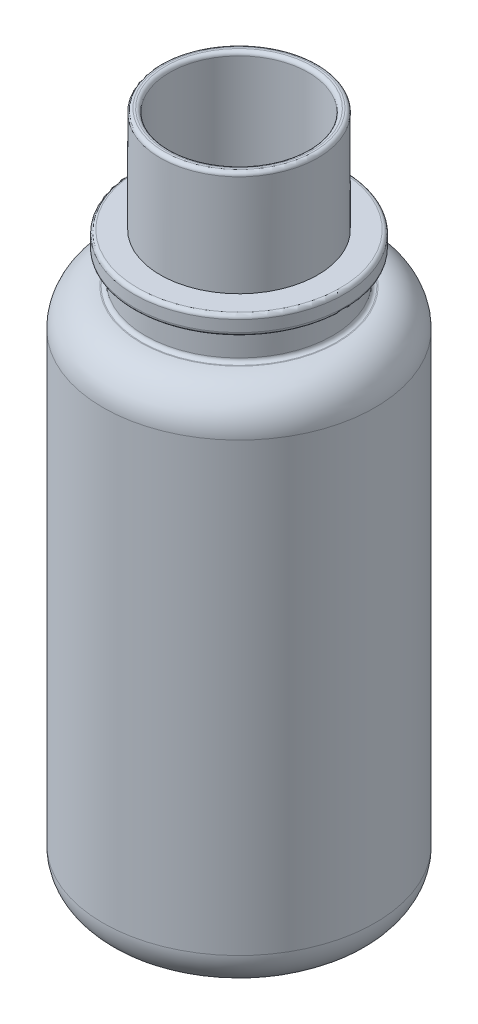
ISO-10303-21;
HEADER;
FILE_DESCRIPTION(('STEP AP214'),'2;1');
FILE_NAME('part.step','',(''),(''),'','','');
FILE_SCHEMA(('AUTOMOTIVE_DESIGN { 1 0 10303 214 1 1 1 1 }'));
ENDSEC;
DATA;
#1=APPLICATION_CONTEXT('core data for automotive mechanical design processes');
#2=APPLICATION_PROTOCOL_DEFINITION('international standard','automotive_design',2000,#1);
#3=PRODUCT_CONTEXT('',#1,'mechanical');
#4=PRODUCT('Part','Part','',(#3));
#5=PRODUCT_RELATED_PRODUCT_CATEGORY('part','',(#4));
#6=PRODUCT_DEFINITION_FORMATION('','',#4);
#7=PRODUCT_DEFINITION_CONTEXT('part definition',#1,'design');
#8=PRODUCT_DEFINITION('design','',#6,#7);
#9=PRODUCT_DEFINITION_SHAPE('','',#8);
#10=(LENGTH_UNIT() NAMED_UNIT(*) SI_UNIT(.MILLI.,.METRE.));
#11=(NAMED_UNIT(*) PLANE_ANGLE_UNIT() SI_UNIT($,.RADIAN.));
#12=(NAMED_UNIT(*) SI_UNIT($,.STERADIAN.) SOLID_ANGLE_UNIT());
#13=UNCERTAINTY_MEASURE_WITH_UNIT(LENGTH_MEASURE(1.E-05),#10,'distance_accuracy_value','');
#14=(GEOMETRIC_REPRESENTATION_CONTEXT(3) GLOBAL_UNCERTAINTY_ASSIGNED_CONTEXT((#13)) GLOBAL_UNIT_ASSIGNED_CONTEXT((#10,
#11,#12)) REPRESENTATION_CONTEXT('',''));
#15=CARTESIAN_POINT('',(0.,0.,0.));
#16=DIRECTION('',(0.,0.,1.));
#17=DIRECTION('',(1.,0.,0.));
#18=AXIS2_PLACEMENT_3D('',#15,#16,#17);
#19=CARTESIAN_POINT('',(0.,0.,0.));
#20=DIRECTION('',(0.,-1.,0.));
#21=DIRECTION('',(0.,0.,-1.));
#22=AXIS2_PLACEMENT_3D('',#19,#20,#21);
#23=PLANE('',#22);
#24=CARTESIAN_POINT('',(0.,0.,0.));
#25=DIRECTION('',(0.,-1.,0.));
#26=DIRECTION('',(0.,0.,-1.));
#27=AXIS2_PLACEMENT_3D('',#24,#25,#26);
#28=CIRCLE('',#27,13.335);
#29=CARTESIAN_POINT('',(0.,0.,-13.335));
#30=VERTEX_POINT('',#29);
#31=EDGE_CURVE('E100',#30,#30,#28,.T.);
#32=ORIENTED_EDGE('',*,*,#31,.T.);
#33=EDGE_LOOP('',(#32));
#34=FACE_BOUND('',#33,.T.);
#35=ADVANCED_FACE('F35',(#34),#23,.T.);
#36=CARTESIAN_POINT('',(0.,0.,0.));
#37=DIRECTION('',(0.,-1.,0.));
#38=DIRECTION('',(0.,0.,-1.));
#39=AXIS2_PLACEMENT_3D('',#36,#37,#38);
#40=CYLINDRICAL_SURFACE('',#39,18.415);
#41=CARTESIAN_POINT('',(0.,5.08,0.));
#42=DIRECTION('',(0.,-1.,0.));
#43=DIRECTION('',(0.,0.,-1.));
#44=AXIS2_PLACEMENT_3D('',#41,#42,#43);
#45=CIRCLE('',#44,18.415);
#46=CARTESIAN_POINT('',(0.,5.08,-18.415));
#47=VERTEX_POINT('',#46);
#48=EDGE_CURVE('E94',#47,#47,#45,.F.);
#49=ORIENTED_EDGE('',*,*,#48,.T.);
#50=EDGE_LOOP('',(#49));
#51=FACE_BOUND('',#50,.T.);
#52=CARTESIAN_POINT('',(0.,65.532,0.));
#53=DIRECTION('',(0.,1.,0.));
#54=DIRECTION('',(0.,0.,1.));
#55=AXIS2_PLACEMENT_3D('',#52,#53,#54);
#56=CIRCLE('',#55,18.415);
#57=CARTESIAN_POINT('',(0.,65.532,18.415));
#58=VERTEX_POINT('',#57);
#59=EDGE_CURVE('E97',#58,#58,#56,.F.);
#60=ORIENTED_EDGE('',*,*,#59,.T.);
#61=EDGE_LOOP('',(#60));
#62=FACE_BOUND('',#61,.T.);
#63=ADVANCED_FACE('F139',(#51,#62),#40,.T.);
#64=CARTESIAN_POINT('',(18.415,70.612,0.));
#65=DIRECTION('',(0.,1.,0.));
#66=DIRECTION('',(0.,0.,1.));
#67=AXIS2_PLACEMENT_3D('',#64,#65,#66);
#68=PLANE('',#67);
#69=CARTESIAN_POINT('',(0.,70.612,0.));
#70=DIRECTION('',(0.,1.,0.));
#71=DIRECTION('',(0.,0.,1.));
#72=AXIS2_PLACEMENT_3D('',#69,#70,#71);
#73=CIRCLE('',#72,13.208);
#74=CARTESIAN_POINT('',(0.,70.612,13.208));
#75=VERTEX_POINT('',#74);
#76=EDGE_CURVE('E58',#75,#75,#73,.F.);
#77=ORIENTED_EDGE('',*,*,#76,.T.);
#78=EDGE_LOOP('',(#77));
#79=FACE_BOUND('',#78,.T.);
#80=CARTESIAN_POINT('',(0.,70.612,0.));
#81=DIRECTION('',(0.,1.,0.));
#82=DIRECTION('',(0.,0.,1.));
#83=AXIS2_PLACEMENT_3D('',#80,#81,#82);
#84=CIRCLE('',#83,13.335);
#85=CARTESIAN_POINT('',(0.,70.612,13.335));
#86=VERTEX_POINT('',#85);
#87=EDGE_CURVE('E91',#86,#86,#84,.T.);
#88=ORIENTED_EDGE('',*,*,#87,.T.);
#89=EDGE_LOOP('',(#88));
#90=FACE_BOUND('',#89,.T.);
#91=ADVANCED_FACE('F145',(#79,#90),#68,.T.);
#92=CARTESIAN_POINT('',(0.,0.,0.));
#93=DIRECTION('',(0.,-1.,0.));
#94=DIRECTION('',(0.,0.,-1.));
#95=AXIS2_PLACEMENT_3D('',#92,#93,#94);
#96=CYLINDRICAL_SURFACE('',#95,12.7);
#97=CARTESIAN_POINT('',(0.,71.12,0.));
#98=DIRECTION('',(0.,1.,0.));
#99=DIRECTION('',(0.,0.,1.));
#100=AXIS2_PLACEMENT_3D('',#97,#98,#99);
#101=CIRCLE('',#100,12.7);
#102=CARTESIAN_POINT('',(0.,71.12,12.7));
#103=VERTEX_POINT('',#102);
#104=EDGE_CURVE('E55',#103,#103,#101,.T.);
#105=ORIENTED_EDGE('',*,*,#104,.T.);
#106=EDGE_LOOP('',(#105));
#107=FACE_BOUND('',#106,.T.);
#108=CARTESIAN_POINT('',(0.,74.676,0.));
#109=DIRECTION('',(0.,-1.,0.));
#110=DIRECTION('',(0.,0.,-1.));
#111=AXIS2_PLACEMENT_3D('',#108,#109,#110);
#112=CIRCLE('',#111,12.7);
#113=CARTESIAN_POINT('',(0.,74.676,-12.7));
#114=VERTEX_POINT('',#113);
#115=EDGE_CURVE('E115',#114,#114,#112,.T.);
#116=ORIENTED_EDGE('',*,*,#115,.T.);
#117=EDGE_LOOP('',(#116));
#118=FACE_BOUND('',#117,.T.);
#119=ADVANCED_FACE('F203',(#107,#118),#96,.T.);
#120=CARTESIAN_POINT('',(12.7,74.676,0.));
#121=DIRECTION('',(0.,-1.,0.));
#122=DIRECTION('',(0.,0.,-1.));
#123=AXIS2_PLACEMENT_3D('',#120,#121,#122);
#124=PLANE('',#123);
#125=CARTESIAN_POINT('',(0.,74.676,0.));
#126=DIRECTION('',(0.,-1.,0.));
#127=DIRECTION('',(0.,0.,-1.));
#128=AXIS2_PLACEMENT_3D('',#125,#126,#127);
#129=CIRCLE('',#128,13.716);
#130=CARTESIAN_POINT('',(0.,74.676,-13.716));
#131=VERTEX_POINT('',#130);
#132=EDGE_CURVE('E50',#131,#131,#129,.T.);
#133=ORIENTED_EDGE('',*,*,#132,.T.);
#134=EDGE_LOOP('',(#133));
#135=FACE_BOUND('',#134,.T.);
#136=ORIENTED_EDGE('',*,*,#115,.F.);
#137=EDGE_LOOP('',(#136));
#138=FACE_BOUND('',#137,.T.);
#139=ADVANCED_FACE('F200',(#135,#138),#124,.T.);
#140=CARTESIAN_POINT('',(0.,0.,0.));
#141=DIRECTION('',(0.,-1.,0.));
#142=DIRECTION('',(0.,0.,-1.));
#143=AXIS2_PLACEMENT_3D('',#140,#141,#142);
#144=CYLINDRICAL_SURFACE('',#143,14.224);
#145=CARTESIAN_POINT('',(0.,75.184,0.));
#146=DIRECTION('',(0.,-1.,0.));
#147=DIRECTION('',(0.,0.,-1.));
#148=AXIS2_PLACEMENT_3D('',#145,#146,#147);
#149=CIRCLE('',#148,14.224);
#150=CARTESIAN_POINT('',(0.,75.184,-14.224));
#151=VERTEX_POINT('',#150);
#152=EDGE_CURVE('E42',#151,#151,#149,.F.);
#153=ORIENTED_EDGE('',*,*,#152,.T.);
#154=EDGE_LOOP('',(#153));
#155=FACE_BOUND('',#154,.T.);
#156=CARTESIAN_POINT('',(0.,76.708,0.));
#157=DIRECTION('',(0.,1.,0.));
#158=DIRECTION('',(0.,0.,1.));
#159=AXIS2_PLACEMENT_3D('',#156,#157,#158);
#160=CIRCLE('',#159,14.224);
#161=CARTESIAN_POINT('',(0.,76.708,14.224));
#162=VERTEX_POINT('',#161);
#163=EDGE_CURVE('E46',#162,#162,#160,.F.);
#164=ORIENTED_EDGE('',*,*,#163,.T.);
#165=EDGE_LOOP('',(#164));
#166=FACE_BOUND('',#165,.T.);
#167=ADVANCED_FACE('F136',(#155,#166),#144,.T.);
#168=CARTESIAN_POINT('',(10.668,77.216,0.));
#169=DIRECTION('',(0.,1.,0.));
#170=DIRECTION('',(0.,0.,1.));
#171=AXIS2_PLACEMENT_3D('',#168,#169,#170);
#172=PLANE('',#171);
#173=CARTESIAN_POINT('',(0.,77.216,0.));
#174=DIRECTION('',(0.,1.,0.));
#175=DIRECTION('',(0.,0.,1.));
#176=AXIS2_PLACEMENT_3D('',#173,#174,#175);
#177=CIRCLE('',#176,13.716);
#178=CARTESIAN_POINT('',(0.,77.216,13.716));
#179=VERTEX_POINT('',#178);
#180=EDGE_CURVE('E10',#179,#179,#177,.T.);
#181=ORIENTED_EDGE('',*,*,#180,.T.);
#182=EDGE_LOOP('',(#181));
#183=FACE_BOUND('',#182,.T.);
#184=CARTESIAN_POINT('',(0.,77.216,0.));
#185=DIRECTION('',(0.,-1.,0.));
#186=DIRECTION('',(0.,0.,-1.));
#187=AXIS2_PLACEMENT_3D('',#184,#185,#186);
#188=CIRCLE('',#187,10.668);
#189=CARTESIAN_POINT('',(0.,77.216,-10.668));
#190=VERTEX_POINT('',#189);
#191=EDGE_CURVE('E118',#190,#190,#188,.T.);
#192=ORIENTED_EDGE('',*,*,#191,.T.);
#193=EDGE_LOOP('',(#192));
#194=FACE_BOUND('',#193,.T.);
#195=ADVANCED_FACE('F122',(#183,#194),#172,.T.);
#196=CARTESIAN_POINT('',(0.,0.,0.));
#197=DIRECTION('',(0.,-1.,0.));
#198=DIRECTION('',(0.,0.,-1.));
#199=AXIS2_PLACEMENT_3D('',#196,#197,#198);
#200=CYLINDRICAL_SURFACE('',#199,10.668);
#201=CARTESIAN_POINT('',(0.,90.932,0.));
#202=DIRECTION('',(0.,1.,0.));
#203=DIRECTION('',(0.,0.,1.));
#204=AXIS2_PLACEMENT_3D('',#201,#202,#203);
#205=CIRCLE('',#204,10.668);
#206=CARTESIAN_POINT('',(0.,90.932,10.668));
#207=VERTEX_POINT('',#206);
#208=EDGE_CURVE('E88',#207,#207,#205,.F.);
#209=ORIENTED_EDGE('',*,*,#208,.T.);
#210=EDGE_LOOP('',(#209));
#211=FACE_BOUND('',#210,.T.);
#212=ORIENTED_EDGE('',*,*,#191,.F.);
#213=EDGE_LOOP('',(#212));
#214=FACE_BOUND('',#213,.T.);
#215=ADVANCED_FACE('F124',(#211,#214),#200,.T.);
#216=CARTESIAN_POINT('',(9.398,91.44,0.));
#217=DIRECTION('',(0.,1.,0.));
#218=DIRECTION('',(0.,0.,1.));
#219=AXIS2_PLACEMENT_3D('',#216,#217,#218);
#220=PLANE('',#219);
#221=CARTESIAN_POINT('',(0.,91.44,0.));
#222=DIRECTION('',(0.,1.,0.));
#223=DIRECTION('',(0.,0.,1.));
#224=AXIS2_PLACEMENT_3D('',#221,#222,#223);
#225=CIRCLE('',#224,10.16);
#226=CARTESIAN_POINT('',(0.,91.44,10.16));
#227=VERTEX_POINT('',#226);
#228=EDGE_CURVE('E82',#227,#227,#225,.T.);
#229=ORIENTED_EDGE('',*,*,#228,.T.);
#230=EDGE_LOOP('',(#229));
#231=FACE_BOUND('',#230,.T.);
#232=CARTESIAN_POINT('',(0.,91.44,0.));
#233=DIRECTION('',(0.,1.,0.));
#234=DIRECTION('',(0.,0.,1.));
#235=AXIS2_PLACEMENT_3D('',#232,#233,#234);
#236=CIRCLE('',#235,9.906);
#237=CARTESIAN_POINT('',(0.,91.44,9.906));
#238=VERTEX_POINT('',#237);
#239=EDGE_CURVE('E85',#238,#238,#236,.F.);
#240=ORIENTED_EDGE('',*,*,#239,.T.);
#241=EDGE_LOOP('',(#240));
#242=FACE_BOUND('',#241,.T.);
#243=ADVANCED_FACE('F126',(#231,#242),#220,.T.);
#244=CARTESIAN_POINT('',(0.,0.,0.));
#245=DIRECTION('',(0.,-1.,0.));
#246=DIRECTION('',(0.,0.,-1.));
#247=AXIS2_PLACEMENT_3D('',#244,#245,#246);
#248=CYLINDRICAL_SURFACE('',#247,9.398);
#249=CARTESIAN_POINT('',(0.,90.932,0.));
#250=DIRECTION('',(0.,1.,0.));
#251=DIRECTION('',(0.,0.,1.));
#252=AXIS2_PLACEMENT_3D('',#249,#250,#251);
#253=CIRCLE('',#252,9.398);
#254=CARTESIAN_POINT('',(0.,90.932,9.398));
#255=VERTEX_POINT('',#254);
#256=EDGE_CURVE('E76',#255,#255,#253,.T.);
#257=ORIENTED_EDGE('',*,*,#256,.T.);
#258=EDGE_LOOP('',(#257));
#259=FACE_BOUND('',#258,.T.);
#260=CARTESIAN_POINT('',(0.,76.1274450231021,0.));
#261=DIRECTION('',(0.,1.,0.));
#262=DIRECTION('',(0.,0.,1.));
#263=AXIS2_PLACEMENT_3D('',#260,#261,#262);
#264=CIRCLE('',#263,9.398);
#265=CARTESIAN_POINT('',(0.,76.1274450231021,9.398));
#266=VERTEX_POINT('',#265);
#267=EDGE_CURVE('E79',#266,#266,#264,.F.);
#268=ORIENTED_EDGE('',*,*,#267,.T.);
#269=EDGE_LOOP('',(#268));
#270=FACE_BOUND('',#269,.T.);
#271=ADVANCED_FACE('F133',(#259,#270),#248,.F.);
#272=CARTESIAN_POINT('',(0.,75.946,0.));
#273=DIRECTION('',(0.,-1.,0.));
#274=DIRECTION('',(0.,0.,-1.));
#275=AXIS2_PLACEMENT_3D('',#272,#273,#274);
#276=CONICAL_SURFACE('',#275,9.398,0.686105323655646);
#277=CARTESIAN_POINT('',(0.,75.8056124899571,0.));
#278=DIRECTION('',(0.,1.,0.));
#279=DIRECTION('',(0.,0.,1.));
#280=AXIS2_PLACEMENT_3D('',#277,#278,#279);
#281=CIRCLE('',#280,9.51295061301477);
#282=CARTESIAN_POINT('',(0.,75.8056124899571,9.51295061301477));
#283=VERTEX_POINT('',#282);
#284=EDGE_CURVE('E70',#283,#283,#281,.T.);
#285=ORIENTED_EDGE('',*,*,#284,.T.);
#286=EDGE_LOOP('',(#285));
#287=FACE_BOUND('',#286,.T.);
#288=CARTESIAN_POINT('',(0.,73.6047354950985,0.));
#289=DIRECTION('',(0.,-1.,0.));
#290=DIRECTION('',(0.,0.,-1.));
#291=AXIS2_PLACEMENT_3D('',#288,#289,#290);
#292=CIRCLE('',#291,11.3150493869852);
#293=CARTESIAN_POINT('',(0.,73.6047354950985,-11.3150493869852));
#294=VERTEX_POINT('',#293);
#295=EDGE_CURVE('E73',#294,#294,#292,.T.);
#296=ORIENTED_EDGE('',*,*,#295,.T.);
#297=EDGE_LOOP('',(#296));
#298=FACE_BOUND('',#297,.T.);
#299=ADVANCED_FACE('F246',(#287,#298),#276,.F.);
#300=CARTESIAN_POINT('',(0.,0.,0.));
#301=DIRECTION('',(0.,-1.,0.));
#302=DIRECTION('',(0.,0.,-1.));
#303=AXIS2_PLACEMENT_3D('',#300,#301,#302);
#304=CYLINDRICAL_SURFACE('',#303,11.43);
#305=CARTESIAN_POINT('',(0.,73.2829029619535,0.));
#306=DIRECTION('',(0.,-1.,0.));
#307=DIRECTION('',(0.,0.,-1.));
#308=AXIS2_PLACEMENT_3D('',#305,#306,#307);
#309=CIRCLE('',#308,11.43);
#310=CARTESIAN_POINT('',(0.,73.2829029619535,-11.43));
#311=VERTEX_POINT('',#310);
#312=EDGE_CURVE('E64',#311,#311,#309,.F.);
#313=ORIENTED_EDGE('',*,*,#312,.T.);
#314=EDGE_LOOP('',(#313));
#315=FACE_BOUND('',#314,.T.);
#316=CARTESIAN_POINT('',(0.,69.85,0.));
#317=DIRECTION('',(0.,-1.,0.));
#318=DIRECTION('',(0.,0.,-1.));
#319=AXIS2_PLACEMENT_3D('',#316,#317,#318);
#320=CIRCLE('',#319,11.43);
#321=CARTESIAN_POINT('',(0.,69.85,-11.43));
#322=VERTEX_POINT('',#321);
#323=EDGE_CURVE('E67',#322,#322,#320,.T.);
#324=ORIENTED_EDGE('',*,*,#323,.T.);
#325=EDGE_LOOP('',(#324));
#326=FACE_BOUND('',#325,.T.);
#327=ADVANCED_FACE('F256',(#315,#326),#304,.F.);
#328=CARTESIAN_POINT('',(11.43,69.342,0.));
#329=DIRECTION('',(0.,-1.,0.));
#330=DIRECTION('',(0.,0.,-1.));
#331=AXIS2_PLACEMENT_3D('',#328,#329,#330);
#332=PLANE('',#331);
#333=CARTESIAN_POINT('',(0.,69.342,0.));
#334=DIRECTION('',(0.,-1.,0.));
#335=DIRECTION('',(0.,0.,-1.));
#336=AXIS2_PLACEMENT_3D('',#333,#334,#335);
#337=CIRCLE('',#336,11.938);
#338=CARTESIAN_POINT('',(0.,69.342,-11.938));
#339=VERTEX_POINT('',#338);
#340=EDGE_CURVE('E61',#339,#339,#337,.F.);
#341=ORIENTED_EDGE('',*,*,#340,.T.);
#342=EDGE_LOOP('',(#341));
#343=FACE_BOUND('',#342,.T.);
#344=CARTESIAN_POINT('',(0.,69.342,0.));
#345=DIRECTION('',(0.,-1.,0.));
#346=DIRECTION('',(0.,0.,-1.));
#347=AXIS2_PLACEMENT_3D('',#344,#345,#346);
#348=CIRCLE('',#347,12.065);
#349=CARTESIAN_POINT('',(0.,69.342,-12.065));
#350=VERTEX_POINT('',#349);
#351=EDGE_CURVE('E103',#350,#350,#348,.T.);
#352=ORIENTED_EDGE('',*,*,#351,.T.);
#353=EDGE_LOOP('',(#352));
#354=FACE_BOUND('',#353,.T.);
#355=ADVANCED_FACE('F266',(#343,#354),#332,.T.);
#356=CARTESIAN_POINT('',(0.,0.,0.));
#357=DIRECTION('',(0.,-1.,0.));
#358=DIRECTION('',(0.,0.,-1.));
#359=AXIS2_PLACEMENT_3D('',#356,#357,#358);
#360=CYLINDRICAL_SURFACE('',#359,17.145);
#361=CARTESIAN_POINT('',(0.,6.35,0.));
#362=DIRECTION('',(0.,1.,0.));
#363=DIRECTION('',(0.,0.,1.));
#364=AXIS2_PLACEMENT_3D('',#361,#362,#363);
#365=CIRCLE('',#364,17.145);
#366=CARTESIAN_POINT('',(0.,6.35,17.145));
#367=VERTEX_POINT('',#366);
#368=EDGE_CURVE('E109',#367,#367,#365,.F.);
#369=ORIENTED_EDGE('',*,*,#368,.T.);
#370=EDGE_LOOP('',(#369));
#371=FACE_BOUND('',#370,.T.);
#372=CARTESIAN_POINT('',(0.,64.262,0.));
#373=DIRECTION('',(0.,-1.,0.));
#374=DIRECTION('',(0.,0.,-1.));
#375=AXIS2_PLACEMENT_3D('',#372,#373,#374);
#376=CIRCLE('',#375,17.145);
#377=CARTESIAN_POINT('',(0.,64.262,-17.145));
#378=VERTEX_POINT('',#377);
#379=EDGE_CURVE('E112',#378,#378,#376,.F.);
#380=ORIENTED_EDGE('',*,*,#379,.T.);
#381=EDGE_LOOP('',(#380));
#382=FACE_BOUND('',#381,.T.);
#383=ADVANCED_FACE('F276',(#371,#382),#360,.F.);
#384=CARTESIAN_POINT('',(17.145,1.27,0.));
#385=DIRECTION('',(0.,1.,0.));
#386=DIRECTION('',(0.,0.,1.));
#387=AXIS2_PLACEMENT_3D('',#384,#385,#386);
#388=PLANE('',#387);
#389=CARTESIAN_POINT('',(0.,1.27,0.));
#390=DIRECTION('',(0.,1.,0.));
#391=DIRECTION('',(0.,0.,1.));
#392=AXIS2_PLACEMENT_3D('',#389,#390,#391);
#393=CIRCLE('',#392,12.065);
#394=CARTESIAN_POINT('',(0.,1.27,12.065));
#395=VERTEX_POINT('',#394);
#396=EDGE_CURVE('E106',#395,#395,#393,.T.);
#397=ORIENTED_EDGE('',*,*,#396,.T.);
#398=EDGE_LOOP('',(#397));
#399=FACE_BOUND('',#398,.T.);
#400=ADVANCED_FACE('F154',(#399),#388,.T.);
#401=CARTESIAN_POINT('',(0.,6.35,0.));
#402=DIRECTION('',(0.,1.,0.));
#403=DIRECTION('',(0.,0.,1.));
#404=AXIS2_PLACEMENT_3D('',#401,#402,#403);
#405=TOROIDAL_SURFACE('',#404,12.065,5.08);
#406=ORIENTED_EDGE('',*,*,#396,.F.);
#407=EDGE_LOOP('',(#406));
#408=FACE_BOUND('',#407,.T.);
#409=ORIENTED_EDGE('',*,*,#368,.F.);
#410=EDGE_LOOP('',(#409));
#411=FACE_BOUND('',#410,.T.);
#412=ADVANCED_FACE('F150',(#408,#411),#405,.F.);
#413=CARTESIAN_POINT('',(0.,64.262,0.));
#414=DIRECTION('',(0.,-1.,0.));
#415=DIRECTION('',(0.,0.,-1.));
#416=AXIS2_PLACEMENT_3D('',#413,#414,#415);
#417=TOROIDAL_SURFACE('',#416,12.065,5.08);
#418=ORIENTED_EDGE('',*,*,#379,.F.);
#419=EDGE_LOOP('',(#418));
#420=FACE_BOUND('',#419,.T.);
#421=ORIENTED_EDGE('',*,*,#351,.F.);
#422=EDGE_LOOP('',(#421));
#423=FACE_BOUND('',#422,.T.);
#424=ADVANCED_FACE('F153',(#420,#423),#417,.F.);
#425=CARTESIAN_POINT('',(0.,5.08,0.));
#426=DIRECTION('',(0.,-1.,0.));
#427=DIRECTION('',(0.,0.,-1.));
#428=AXIS2_PLACEMENT_3D('',#425,#426,#427);
#429=TOROIDAL_SURFACE('',#428,13.335,5.08);
#430=ORIENTED_EDGE('',*,*,#48,.F.);
#431=EDGE_LOOP('',(#430));
#432=FACE_BOUND('',#431,.T.);
#433=ORIENTED_EDGE('',*,*,#31,.F.);
#434=EDGE_LOOP('',(#433));
#435=FACE_BOUND('',#434,.T.);
#436=ADVANCED_FACE('F158',(#432,#435),#429,.T.);
#437=CARTESIAN_POINT('',(0.,65.532,0.));
#438=DIRECTION('',(0.,1.,0.));
#439=DIRECTION('',(0.,0.,1.));
#440=AXIS2_PLACEMENT_3D('',#437,#438,#439);
#441=TOROIDAL_SURFACE('',#440,13.335,5.08);
#442=ORIENTED_EDGE('',*,*,#87,.F.);
#443=EDGE_LOOP('',(#442));
#444=FACE_BOUND('',#443,.T.);
#445=ORIENTED_EDGE('',*,*,#59,.F.);
#446=EDGE_LOOP('',(#445));
#447=FACE_BOUND('',#446,.T.);
#448=ADVANCED_FACE('F162',(#444,#447),#441,.T.);
#449=CARTESIAN_POINT('',(0.,90.932,0.));
#450=DIRECTION('',(0.,1.,0.));
#451=DIRECTION('',(0.,0.,1.));
#452=AXIS2_PLACEMENT_3D('',#449,#450,#451);
#453=TOROIDAL_SURFACE('',#452,10.16,0.508);
#454=ORIENTED_EDGE('',*,*,#228,.F.);
#455=EDGE_LOOP('',(#454));
#456=FACE_BOUND('',#455,.T.);
#457=ORIENTED_EDGE('',*,*,#208,.F.);
#458=EDGE_LOOP('',(#457));
#459=FACE_BOUND('',#458,.T.);
#460=ADVANCED_FACE('F166',(#456,#459),#453,.T.);
#461=CARTESIAN_POINT('',(0.,90.932,0.));
#462=DIRECTION('',(0.,1.,0.));
#463=DIRECTION('',(0.,0.,1.));
#464=AXIS2_PLACEMENT_3D('',#461,#462,#463);
#465=TOROIDAL_SURFACE('',#464,9.906,0.508);
#466=ORIENTED_EDGE('',*,*,#256,.F.);
#467=EDGE_LOOP('',(#466));
#468=FACE_BOUND('',#467,.T.);
#469=ORIENTED_EDGE('',*,*,#239,.F.);
#470=EDGE_LOOP('',(#469));
#471=FACE_BOUND('',#470,.T.);
#472=ADVANCED_FACE('F170',(#468,#471),#465,.T.);
#473=CARTESIAN_POINT('',(0.,76.1274450231021,0.));
#474=DIRECTION('',(0.,1.,0.));
#475=DIRECTION('',(0.,0.,1.));
#476=AXIS2_PLACEMENT_3D('',#473,#474,#475);
#477=TOROIDAL_SURFACE('',#476,9.906,0.508);
#478=ORIENTED_EDGE('',*,*,#284,.F.);
#479=EDGE_LOOP('',(#478));
#480=FACE_BOUND('',#479,.T.);
#481=ORIENTED_EDGE('',*,*,#267,.F.);
#482=EDGE_LOOP('',(#481));
#483=FACE_BOUND('',#482,.T.);
#484=ADVANCED_FACE('F174',(#480,#483),#477,.T.);
#485=CARTESIAN_POINT('',(0.,73.2829029619535,0.));
#486=DIRECTION('',(0.,-1.,0.));
#487=DIRECTION('',(0.,0.,-1.));
#488=AXIS2_PLACEMENT_3D('',#485,#486,#487);
#489=TOROIDAL_SURFACE('',#488,10.922,0.508);
#490=ORIENTED_EDGE('',*,*,#312,.F.);
#491=EDGE_LOOP('',(#490));
#492=FACE_BOUND('',#491,.T.);
#493=ORIENTED_EDGE('',*,*,#295,.F.);
#494=EDGE_LOOP('',(#493));
#495=FACE_BOUND('',#494,.T.);
#496=ADVANCED_FACE('F178',(#492,#495),#489,.F.);
#497=CARTESIAN_POINT('',(0.,69.85,0.));
#498=DIRECTION('',(0.,-1.,0.));
#499=DIRECTION('',(0.,0.,-1.));
#500=AXIS2_PLACEMENT_3D('',#497,#498,#499);
#501=TOROIDAL_SURFACE('',#500,11.938,0.508);
#502=ORIENTED_EDGE('',*,*,#340,.F.);
#503=EDGE_LOOP('',(#502));
#504=FACE_BOUND('',#503,.T.);
#505=ORIENTED_EDGE('',*,*,#323,.F.);
#506=EDGE_LOOP('',(#505));
#507=FACE_BOUND('',#506,.T.);
#508=ADVANCED_FACE('F182',(#504,#507),#501,.T.);
#509=CARTESIAN_POINT('',(0.,71.12,0.));
#510=DIRECTION('',(0.,1.,0.));
#511=DIRECTION('',(0.,0.,1.));
#512=AXIS2_PLACEMENT_3D('',#509,#510,#511);
#513=TOROIDAL_SURFACE('',#512,13.208,0.508);
#514=ORIENTED_EDGE('',*,*,#104,.F.);
#515=EDGE_LOOP('',(#514));
#516=FACE_BOUND('',#515,.T.);
#517=ORIENTED_EDGE('',*,*,#76,.F.);
#518=EDGE_LOOP('',(#517));
#519=FACE_BOUND('',#518,.T.);
#520=ADVANCED_FACE('F186',(#516,#519),#513,.F.);
#521=CARTESIAN_POINT('',(0.,75.184,0.));
#522=DIRECTION('',(0.,-1.,0.));
#523=DIRECTION('',(0.,0.,-1.));
#524=AXIS2_PLACEMENT_3D('',#521,#522,#523);
#525=TOROIDAL_SURFACE('',#524,13.716,0.508);
#526=ORIENTED_EDGE('',*,*,#152,.F.);
#527=EDGE_LOOP('',(#526));
#528=FACE_BOUND('',#527,.T.);
#529=ORIENTED_EDGE('',*,*,#132,.F.);
#530=EDGE_LOOP('',(#529));
#531=FACE_BOUND('',#530,.T.);
#532=ADVANCED_FACE('F189',(#528,#531),#525,.T.);
#533=CARTESIAN_POINT('',(0.,76.708,0.));
#534=DIRECTION('',(0.,1.,0.));
#535=DIRECTION('',(0.,0.,1.));
#536=AXIS2_PLACEMENT_3D('',#533,#534,#535);
#537=TOROIDAL_SURFACE('',#536,13.716,0.508);
#538=ORIENTED_EDGE('',*,*,#180,.F.);
#539=EDGE_LOOP('',(#538));
#540=FACE_BOUND('',#539,.T.);
#541=ORIENTED_EDGE('',*,*,#163,.F.);
#542=EDGE_LOOP('',(#541));
#543=FACE_BOUND('',#542,.T.);
#544=ADVANCED_FACE('F37',(#540,#543),#537,.T.);
#545=CLOSED_SHELL('',(#35,#63,#91,#119,#139,#167,#195,#215,#243,#271,#299,#327,#355,#383,#400,
#412,#424,#436,#448,#460,#472,#484,#496,#508,#520,#532,#544));
#546=MANIFOLD_SOLID_BREP('B2',#545);
#547=ADVANCED_BREP_SHAPE_REPRESENTATION('',(#18,#546),#14);
#548=SHAPE_DEFINITION_REPRESENTATION(#9,#547);
ENDSEC;
END-ISO-10303-21;
